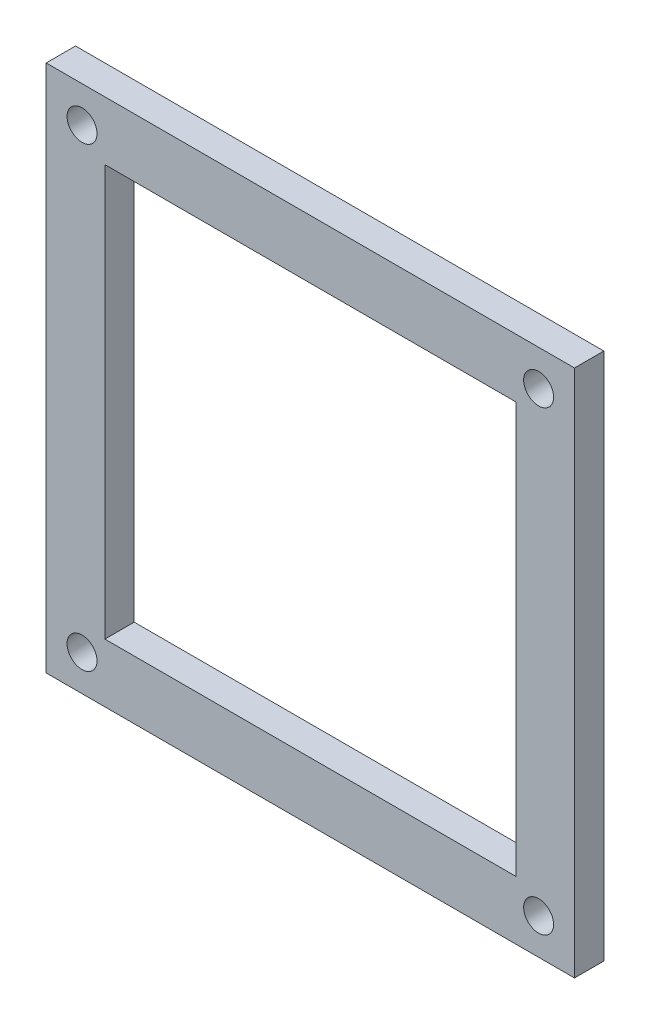
ISO-10303-21;
HEADER;
FILE_DESCRIPTION(('STEP AP214'),'2;1');
FILE_NAME('part.step','',(''),(''),'','','');
FILE_SCHEMA(('AUTOMOTIVE_DESIGN { 1 0 10303 214 1 1 1 1 }'));
ENDSEC;
DATA;
#1=APPLICATION_CONTEXT('core data for automotive mechanical design processes');
#2=APPLICATION_PROTOCOL_DEFINITION('international standard','automotive_design',2000,#1);
#3=PRODUCT_CONTEXT('',#1,'mechanical');
#4=PRODUCT('Part','Part','',(#3));
#5=PRODUCT_RELATED_PRODUCT_CATEGORY('part','',(#4));
#6=PRODUCT_DEFINITION_FORMATION('','',#4);
#7=PRODUCT_DEFINITION_CONTEXT('part definition',#1,'design');
#8=PRODUCT_DEFINITION('design','',#6,#7);
#9=PRODUCT_DEFINITION_SHAPE('','',#8);
#10=(LENGTH_UNIT() NAMED_UNIT(*) SI_UNIT(.MILLI.,.METRE.));
#11=(NAMED_UNIT(*) PLANE_ANGLE_UNIT() SI_UNIT($,.RADIAN.));
#12=(NAMED_UNIT(*) SI_UNIT($,.STERADIAN.) SOLID_ANGLE_UNIT());
#13=UNCERTAINTY_MEASURE_WITH_UNIT(LENGTH_MEASURE(1.E-05),#10,'distance_accuracy_value','');
#14=(GEOMETRIC_REPRESENTATION_CONTEXT(3) GLOBAL_UNCERTAINTY_ASSIGNED_CONTEXT((#13)) GLOBAL_UNIT_ASSIGNED_CONTEXT((#10,
#11,#12)) REPRESENTATION_CONTEXT('',''));
#15=CARTESIAN_POINT('',(0.,0.,0.));
#16=DIRECTION('',(0.,0.,1.));
#17=DIRECTION('',(1.,0.,0.));
#18=AXIS2_PLACEMENT_3D('',#15,#16,#17);
#19=CARTESIAN_POINT('',(0.,0.,5.));
#20=DIRECTION('',(0.,0.,1.));
#21=DIRECTION('',(1.,0.,0.));
#22=AXIS2_PLACEMENT_3D('',#19,#20,#21);
#23=PLANE('',#22);
#24=CARTESIAN_POINT('',(38.8908729652601,-38.8908729652601,5.));
#25=DIRECTION('',(0.,0.,1.));
#26=DIRECTION('',(1.,0.,0.));
#27=AXIS2_PLACEMENT_3D('',#24,#25,#26);
#28=CIRCLE('',#27,2.55);
#29=CARTESIAN_POINT('',(41.4408729652601,-38.8908729652601,5.));
#30=VERTEX_POINT('',#29);
#31=EDGE_CURVE('E245',#30,#30,#28,.T.);
#32=ORIENTED_EDGE('',*,*,#31,.F.);
#33=EDGE_LOOP('',(#32));
#34=FACE_BOUND('',#33,.T.);
#35=CARTESIAN_POINT('',(-38.8908729652601,38.8908729652601,5.));
#36=DIRECTION('',(0.,0.,1.));
#37=DIRECTION('',(1.,0.,0.));
#38=AXIS2_PLACEMENT_3D('',#35,#36,#37);
#39=CIRCLE('',#38,2.55);
#40=CARTESIAN_POINT('',(-36.3408729652601,38.8908729652601,5.));
#41=VERTEX_POINT('',#40);
#42=EDGE_CURVE('E127',#41,#41,#39,.T.);
#43=ORIENTED_EDGE('',*,*,#42,.F.);
#44=EDGE_LOOP('',(#43));
#45=FACE_BOUND('',#44,.T.);
#46=DIRECTION('',(0.,-1.,0.));
#47=VECTOR('',#46,1.);
#48=CARTESIAN_POINT('',(-45.,-45.,5.));
#49=LINE('',#48,#47);
#50=CARTESIAN_POINT('',(-45.,45.,5.));
#51=VERTEX_POINT('',#50);
#52=CARTESIAN_POINT('',(-45.,-45.,5.));
#53=VERTEX_POINT('',#52);
#54=EDGE_CURVE('E137',#51,#53,#49,.T.);
#55=ORIENTED_EDGE('',*,*,#54,.T.);
#56=DIRECTION('',(1.,0.,0.));
#57=VECTOR('',#56,1.);
#58=CARTESIAN_POINT('',(45.,-45.,5.));
#59=LINE('',#58,#57);
#60=CARTESIAN_POINT('',(45.,-45.,5.));
#61=VERTEX_POINT('',#60);
#62=EDGE_CURVE('E140',#53,#61,#59,.T.);
#63=ORIENTED_EDGE('',*,*,#62,.T.);
#64=DIRECTION('',(0.,1.,0.));
#65=VECTOR('',#64,1.);
#66=CARTESIAN_POINT('',(45.,-45.,5.));
#67=LINE('',#66,#65);
#68=CARTESIAN_POINT('',(45.,45.,5.));
#69=VERTEX_POINT('',#68);
#70=EDGE_CURVE('E143',#61,#69,#67,.T.);
#71=ORIENTED_EDGE('',*,*,#70,.T.);
#72=DIRECTION('',(-1.,0.,0.));
#73=VECTOR('',#72,1.);
#74=CARTESIAN_POINT('',(45.,45.,5.));
#75=LINE('',#74,#73);
#76=EDGE_CURVE('E145',#69,#51,#75,.T.);
#77=ORIENTED_EDGE('',*,*,#76,.T.);
#78=EDGE_LOOP('',(#55,#63,#71,#77));
#79=FACE_BOUND('',#78,.T.);
#80=DIRECTION('',(1.,0.,0.));
#81=VECTOR('',#80,1.);
#82=CARTESIAN_POINT('',(35.,-35.,5.));
#83=LINE('',#82,#81);
#84=CARTESIAN_POINT('',(-35.,-35.,5.));
#85=VERTEX_POINT('',#84);
#86=CARTESIAN_POINT('',(35.,-35.,5.));
#87=VERTEX_POINT('',#86);
#88=EDGE_CURVE('E106',#85,#87,#83,.T.);
#89=ORIENTED_EDGE('',*,*,#88,.F.);
#90=DIRECTION('',(0.,-1.,0.));
#91=VECTOR('',#90,1.);
#92=CARTESIAN_POINT('',(-35.,-35.,5.));
#93=LINE('',#92,#91);
#94=CARTESIAN_POINT('',(-35.,35.,5.));
#95=VERTEX_POINT('',#94);
#96=EDGE_CURVE('E98',#95,#85,#93,.T.);
#97=ORIENTED_EDGE('',*,*,#96,.F.);
#98=DIRECTION('',(-1.,0.,0.));
#99=VECTOR('',#98,1.);
#100=CARTESIAN_POINT('',(35.,35.,5.));
#101=LINE('',#100,#99);
#102=CARTESIAN_POINT('',(35.,35.,5.));
#103=VERTEX_POINT('',#102);
#104=EDGE_CURVE('E121',#103,#95,#101,.T.);
#105=ORIENTED_EDGE('',*,*,#104,.F.);
#106=DIRECTION('',(0.,1.,0.));
#107=VECTOR('',#106,1.);
#108=CARTESIAN_POINT('',(35.,-35.,5.));
#109=LINE('',#108,#107);
#110=EDGE_CURVE('E119',#87,#103,#109,.T.);
#111=ORIENTED_EDGE('',*,*,#110,.F.);
#112=EDGE_LOOP('',(#89,#97,#105,#111));
#113=FACE_BOUND('',#112,.T.);
#114=CARTESIAN_POINT('',(38.8908729652601,38.8908729652601,5.));
#115=DIRECTION('',(0.,0.,1.));
#116=DIRECTION('',(-1.,0.,0.));
#117=AXIS2_PLACEMENT_3D('',#114,#115,#116);
#118=CIRCLE('',#117,2.55);
#119=CARTESIAN_POINT('',(36.3408729652601,38.8908729652601,5.));
#120=VERTEX_POINT('',#119);
#121=EDGE_CURVE('E251',#120,#120,#118,.T.);
#122=ORIENTED_EDGE('',*,*,#121,.F.);
#123=EDGE_LOOP('',(#122));
#124=FACE_BOUND('',#123,.T.);
#125=CARTESIAN_POINT('',(-38.8908729652601,-38.8908729652601,5.));
#126=DIRECTION('',(0.,0.,1.));
#127=DIRECTION('',(-1.,0.,0.));
#128=AXIS2_PLACEMENT_3D('',#125,#126,#127);
#129=CIRCLE('',#128,2.55);
#130=CARTESIAN_POINT('',(-41.4408729652601,-38.8908729652601,5.));
#131=VERTEX_POINT('',#130);
#132=EDGE_CURVE('E236',#131,#131,#129,.T.);
#133=ORIENTED_EDGE('',*,*,#132,.F.);
#134=EDGE_LOOP('',(#133));
#135=FACE_BOUND('',#134,.T.);
#136=ADVANCED_FACE('F33',(#34,#45,#79,#113,#124,#135),#23,.T.);
#137=CARTESIAN_POINT('',(0.,0.,0.));
#138=DIRECTION('',(0.,0.,1.));
#139=DIRECTION('',(1.,0.,0.));
#140=AXIS2_PLACEMENT_3D('',#137,#138,#139);
#141=PLANE('',#140);
#142=DIRECTION('',(0.,-1.,0.));
#143=VECTOR('',#142,1.);
#144=CARTESIAN_POINT('',(-45.,-45.,0.));
#145=LINE('',#144,#143);
#146=CARTESIAN_POINT('',(-45.,45.,0.));
#147=VERTEX_POINT('',#146);
#148=CARTESIAN_POINT('',(-45.,-45.,0.));
#149=VERTEX_POINT('',#148);
#150=EDGE_CURVE('E114',#147,#149,#145,.T.);
#151=ORIENTED_EDGE('',*,*,#150,.F.);
#152=DIRECTION('',(-1.,0.,0.));
#153=VECTOR('',#152,1.);
#154=CARTESIAN_POINT('',(45.,45.,0.));
#155=LINE('',#154,#153);
#156=CARTESIAN_POINT('',(45.,45.,0.));
#157=VERTEX_POINT('',#156);
#158=EDGE_CURVE('E141',#157,#147,#155,.T.);
#159=ORIENTED_EDGE('',*,*,#158,.F.);
#160=DIRECTION('',(0.,1.,0.));
#161=VECTOR('',#160,1.);
#162=CARTESIAN_POINT('',(45.,-45.,0.));
#163=LINE('',#162,#161);
#164=CARTESIAN_POINT('',(45.,-45.,0.));
#165=VERTEX_POINT('',#164);
#166=EDGE_CURVE('E152',#165,#157,#163,.T.);
#167=ORIENTED_EDGE('',*,*,#166,.F.);
#168=DIRECTION('',(1.,0.,0.));
#169=VECTOR('',#168,1.);
#170=CARTESIAN_POINT('',(45.,-45.,0.));
#171=LINE('',#170,#169);
#172=EDGE_CURVE('E150',#149,#165,#171,.T.);
#173=ORIENTED_EDGE('',*,*,#172,.F.);
#174=EDGE_LOOP('',(#151,#159,#167,#173));
#175=FACE_BOUND('',#174,.T.);
#176=DIRECTION('',(0.,-1.,0.));
#177=VECTOR('',#176,1.);
#178=CARTESIAN_POINT('',(-35.,-35.,0.));
#179=LINE('',#178,#177);
#180=CARTESIAN_POINT('',(-35.,35.,0.));
#181=VERTEX_POINT('',#180);
#182=CARTESIAN_POINT('',(-35.,-35.,0.));
#183=VERTEX_POINT('',#182);
#184=EDGE_CURVE('E56',#181,#183,#179,.T.);
#185=ORIENTED_EDGE('',*,*,#184,.T.);
#186=DIRECTION('',(1.,0.,0.));
#187=VECTOR('',#186,1.);
#188=CARTESIAN_POINT('',(35.,-35.,0.));
#189=LINE('',#188,#187);
#190=CARTESIAN_POINT('',(35.,-35.,0.));
#191=VERTEX_POINT('',#190);
#192=EDGE_CURVE('E113',#183,#191,#189,.T.);
#193=ORIENTED_EDGE('',*,*,#192,.T.);
#194=DIRECTION('',(0.,1.,0.));
#195=VECTOR('',#194,1.);
#196=CARTESIAN_POINT('',(35.,-35.,0.));
#197=LINE('',#196,#195);
#198=CARTESIAN_POINT('',(35.,35.,0.));
#199=VERTEX_POINT('',#198);
#200=EDGE_CURVE('E129',#191,#199,#197,.T.);
#201=ORIENTED_EDGE('',*,*,#200,.T.);
#202=DIRECTION('',(-1.,0.,0.));
#203=VECTOR('',#202,1.);
#204=CARTESIAN_POINT('',(35.,35.,0.));
#205=LINE('',#204,#203);
#206=EDGE_CURVE('E107',#199,#181,#205,.T.);
#207=ORIENTED_EDGE('',*,*,#206,.T.);
#208=EDGE_LOOP('',(#185,#193,#201,#207));
#209=FACE_BOUND('',#208,.T.);
#210=CARTESIAN_POINT('',(-38.8908729652601,38.8908729652601,0.));
#211=DIRECTION('',(0.,0.,1.));
#212=DIRECTION('',(1.,0.,0.));
#213=AXIS2_PLACEMENT_3D('',#210,#211,#212);
#214=CIRCLE('',#213,2.55);
#215=CARTESIAN_POINT('',(-36.3408729652601,38.8908729652601,0.));
#216=VERTEX_POINT('',#215);
#217=EDGE_CURVE('E254',#216,#216,#214,.T.);
#218=ORIENTED_EDGE('',*,*,#217,.T.);
#219=EDGE_LOOP('',(#218));
#220=FACE_BOUND('',#219,.T.);
#221=CARTESIAN_POINT('',(38.8908729652601,38.8908729652601,0.));
#222=DIRECTION('',(0.,0.,1.));
#223=DIRECTION('',(-1.,0.,0.));
#224=AXIS2_PLACEMENT_3D('',#221,#222,#223);
#225=CIRCLE('',#224,2.55);
#226=CARTESIAN_POINT('',(36.3408729652601,38.8908729652601,0.));
#227=VERTEX_POINT('',#226);
#228=EDGE_CURVE('E248',#227,#227,#225,.T.);
#229=ORIENTED_EDGE('',*,*,#228,.T.);
#230=EDGE_LOOP('',(#229));
#231=FACE_BOUND('',#230,.T.);
#232=CARTESIAN_POINT('',(38.8908729652601,-38.8908729652601,0.));
#233=DIRECTION('',(0.,0.,1.));
#234=DIRECTION('',(1.,0.,0.));
#235=AXIS2_PLACEMENT_3D('',#232,#233,#234);
#236=CIRCLE('',#235,2.55);
#237=CARTESIAN_POINT('',(41.4408729652601,-38.8908729652601,0.));
#238=VERTEX_POINT('',#237);
#239=EDGE_CURVE('E242',#238,#238,#236,.T.);
#240=ORIENTED_EDGE('',*,*,#239,.T.);
#241=EDGE_LOOP('',(#240));
#242=FACE_BOUND('',#241,.T.);
#243=CARTESIAN_POINT('',(-38.8908729652601,-38.8908729652601,0.));
#244=DIRECTION('',(0.,0.,1.));
#245=DIRECTION('',(-1.,0.,0.));
#246=AXIS2_PLACEMENT_3D('',#243,#244,#245);
#247=CIRCLE('',#246,2.55);
#248=CARTESIAN_POINT('',(-41.4408729652601,-38.8908729652601,0.));
#249=VERTEX_POINT('',#248);
#250=EDGE_CURVE('E239',#249,#249,#247,.T.);
#251=ORIENTED_EDGE('',*,*,#250,.T.);
#252=EDGE_LOOP('',(#251));
#253=FACE_BOUND('',#252,.T.);
#254=ADVANCED_FACE('F170',(#175,#209,#220,#231,#242,#253),#141,.F.);
#255=CARTESIAN_POINT('',(-45.,-45.,5.));
#256=DIRECTION('',(1.,0.,0.));
#257=DIRECTION('',(0.,0.,-1.));
#258=AXIS2_PLACEMENT_3D('',#255,#256,#257);
#259=PLANE('',#258);
#260=ORIENTED_EDGE('',*,*,#150,.T.);
#261=DIRECTION('',(0.,0.,-1.));
#262=VECTOR('',#261,1.);
#263=CARTESIAN_POINT('',(-45.,-45.,5.));
#264=LINE('',#263,#262);
#265=EDGE_CURVE('E11',#53,#149,#264,.T.);
#266=ORIENTED_EDGE('',*,*,#265,.F.);
#267=ORIENTED_EDGE('',*,*,#54,.F.);
#268=DIRECTION('',(0.,0.,-1.));
#269=VECTOR('',#268,1.);
#270=CARTESIAN_POINT('',(-45.,45.,5.));
#271=LINE('',#270,#269);
#272=EDGE_CURVE('E147',#51,#147,#271,.T.);
#273=ORIENTED_EDGE('',*,*,#272,.T.);
#274=EDGE_LOOP('',(#260,#266,#267,#273));
#275=FACE_BOUND('',#274,.T.);
#276=ADVANCED_FACE('F35',(#275),#259,.F.);
#277=CARTESIAN_POINT('',(45.,-45.,5.));
#278=DIRECTION('',(0.,1.,0.));
#279=DIRECTION('',(-1.,0.,0.));
#280=AXIS2_PLACEMENT_3D('',#277,#278,#279);
#281=PLANE('',#280);
#282=ORIENTED_EDGE('',*,*,#172,.T.);
#283=DIRECTION('',(0.,0.,-1.));
#284=VECTOR('',#283,1.);
#285=CARTESIAN_POINT('',(45.,-45.,5.));
#286=LINE('',#285,#284);
#287=EDGE_CURVE('E41',#61,#165,#286,.T.);
#288=ORIENTED_EDGE('',*,*,#287,.F.);
#289=ORIENTED_EDGE('',*,*,#62,.F.);
#290=ORIENTED_EDGE('',*,*,#265,.T.);
#291=EDGE_LOOP('',(#282,#288,#289,#290));
#292=FACE_BOUND('',#291,.T.);
#293=ADVANCED_FACE('F180',(#292),#281,.F.);
#294=CARTESIAN_POINT('',(45.,-45.,5.));
#295=DIRECTION('',(-1.,0.,0.));
#296=DIRECTION('',(0.,0.,1.));
#297=AXIS2_PLACEMENT_3D('',#294,#295,#296);
#298=PLANE('',#297);
#299=ORIENTED_EDGE('',*,*,#166,.T.);
#300=DIRECTION('',(0.,0.,-1.));
#301=VECTOR('',#300,1.);
#302=CARTESIAN_POINT('',(45.,45.,5.));
#303=LINE('',#302,#301);
#304=EDGE_CURVE('E157',#69,#157,#303,.T.);
#305=ORIENTED_EDGE('',*,*,#304,.F.);
#306=ORIENTED_EDGE('',*,*,#70,.F.);
#307=ORIENTED_EDGE('',*,*,#287,.T.);
#308=EDGE_LOOP('',(#299,#305,#306,#307));
#309=FACE_BOUND('',#308,.T.);
#310=ADVANCED_FACE('F164',(#309),#298,.F.);
#311=CARTESIAN_POINT('',(45.,45.,5.));
#312=DIRECTION('',(0.,-1.,0.));
#313=DIRECTION('',(1.,0.,0.));
#314=AXIS2_PLACEMENT_3D('',#311,#312,#313);
#315=PLANE('',#314);
#316=ORIENTED_EDGE('',*,*,#158,.T.);
#317=ORIENTED_EDGE('',*,*,#272,.F.);
#318=ORIENTED_EDGE('',*,*,#76,.F.);
#319=ORIENTED_EDGE('',*,*,#304,.T.);
#320=EDGE_LOOP('',(#316,#317,#318,#319));
#321=FACE_BOUND('',#320,.T.);
#322=ADVANCED_FACE('F174',(#321),#315,.F.);
#323=CARTESIAN_POINT('',(-35.,-35.,5.));
#324=DIRECTION('',(1.,0.,0.));
#325=DIRECTION('',(0.,0.,-1.));
#326=AXIS2_PLACEMENT_3D('',#323,#324,#325);
#327=PLANE('',#326);
#328=ORIENTED_EDGE('',*,*,#184,.F.);
#329=DIRECTION('',(0.,0.,-1.));
#330=VECTOR('',#329,1.);
#331=CARTESIAN_POINT('',(-35.,35.,5.));
#332=LINE('',#331,#330);
#333=EDGE_CURVE('E102',#95,#181,#332,.T.);
#334=ORIENTED_EDGE('',*,*,#333,.F.);
#335=ORIENTED_EDGE('',*,*,#96,.T.);
#336=DIRECTION('',(0.,0.,-1.));
#337=VECTOR('',#336,1.);
#338=CARTESIAN_POINT('',(-35.,-35.,5.));
#339=LINE('',#338,#337);
#340=EDGE_CURVE('E101',#85,#183,#339,.T.);
#341=ORIENTED_EDGE('',*,*,#340,.T.);
#342=EDGE_LOOP('',(#328,#334,#335,#341));
#343=FACE_BOUND('',#342,.T.);
#344=ADVANCED_FACE('F100',(#343),#327,.T.);
#345=CARTESIAN_POINT('',(35.,-35.,5.));
#346=DIRECTION('',(0.,1.,0.));
#347=DIRECTION('',(0.,0.,1.));
#348=AXIS2_PLACEMENT_3D('',#345,#346,#347);
#349=PLANE('',#348);
#350=ORIENTED_EDGE('',*,*,#192,.F.);
#351=ORIENTED_EDGE('',*,*,#340,.F.);
#352=ORIENTED_EDGE('',*,*,#88,.T.);
#353=DIRECTION('',(0.,0.,-1.));
#354=VECTOR('',#353,1.);
#355=CARTESIAN_POINT('',(35.,-35.,5.));
#356=LINE('',#355,#354);
#357=EDGE_CURVE('E115',#87,#191,#356,.T.);
#358=ORIENTED_EDGE('',*,*,#357,.T.);
#359=EDGE_LOOP('',(#350,#351,#352,#358));
#360=FACE_BOUND('',#359,.T.);
#361=ADVANCED_FACE('F110',(#360),#349,.T.);
#362=CARTESIAN_POINT('',(35.,-35.,5.));
#363=DIRECTION('',(-1.,0.,0.));
#364=DIRECTION('',(0.,0.,1.));
#365=AXIS2_PLACEMENT_3D('',#362,#363,#364);
#366=PLANE('',#365);
#367=ORIENTED_EDGE('',*,*,#200,.F.);
#368=ORIENTED_EDGE('',*,*,#357,.F.);
#369=ORIENTED_EDGE('',*,*,#110,.T.);
#370=DIRECTION('',(0.,0.,-1.));
#371=VECTOR('',#370,1.);
#372=CARTESIAN_POINT('',(35.,35.,5.));
#373=LINE('',#372,#371);
#374=EDGE_CURVE('E48',#103,#199,#373,.T.);
#375=ORIENTED_EDGE('',*,*,#374,.T.);
#376=EDGE_LOOP('',(#367,#368,#369,#375));
#377=FACE_BOUND('',#376,.T.);
#378=ADVANCED_FACE('F206',(#377),#366,.T.);
#379=CARTESIAN_POINT('',(35.,35.,5.));
#380=DIRECTION('',(0.,-1.,0.));
#381=DIRECTION('',(0.,0.,-1.));
#382=AXIS2_PLACEMENT_3D('',#379,#380,#381);
#383=PLANE('',#382);
#384=ORIENTED_EDGE('',*,*,#206,.F.);
#385=ORIENTED_EDGE('',*,*,#374,.F.);
#386=ORIENTED_EDGE('',*,*,#104,.T.);
#387=ORIENTED_EDGE('',*,*,#333,.T.);
#388=EDGE_LOOP('',(#384,#385,#386,#387));
#389=FACE_BOUND('',#388,.T.);
#390=ADVANCED_FACE('F210',(#389),#383,.T.);
#391=CARTESIAN_POINT('',(-38.8908729652601,38.8908729652601,5.));
#392=DIRECTION('',(0.,0.,-1.));
#393=DIRECTION('',(-1.,0.,0.));
#394=AXIS2_PLACEMENT_3D('',#391,#392,#393);
#395=CYLINDRICAL_SURFACE('',#394,2.55);
#396=ORIENTED_EDGE('',*,*,#42,.T.);
#397=EDGE_LOOP('',(#396));
#398=FACE_BOUND('',#397,.T.);
#399=ORIENTED_EDGE('',*,*,#217,.F.);
#400=EDGE_LOOP('',(#399));
#401=FACE_BOUND('',#400,.T.);
#402=ADVANCED_FACE('F216',(#398,#401),#395,.F.);
#403=CARTESIAN_POINT('',(38.8908729652601,38.8908729652601,5.));
#404=DIRECTION('',(0.,0.,-1.));
#405=DIRECTION('',(-1.,0.,0.));
#406=AXIS2_PLACEMENT_3D('',#403,#404,#405);
#407=CYLINDRICAL_SURFACE('',#406,2.55);
#408=ORIENTED_EDGE('',*,*,#121,.T.);
#409=EDGE_LOOP('',(#408));
#410=FACE_BOUND('',#409,.T.);
#411=ORIENTED_EDGE('',*,*,#228,.F.);
#412=EDGE_LOOP('',(#411));
#413=FACE_BOUND('',#412,.T.);
#414=ADVANCED_FACE('F219',(#410,#413),#407,.F.);
#415=CARTESIAN_POINT('',(38.8908729652601,-38.8908729652601,5.));
#416=DIRECTION('',(0.,0.,-1.));
#417=DIRECTION('',(-1.,0.,0.));
#418=AXIS2_PLACEMENT_3D('',#415,#416,#417);
#419=CYLINDRICAL_SURFACE('',#418,2.55);
#420=ORIENTED_EDGE('',*,*,#31,.T.);
#421=EDGE_LOOP('',(#420));
#422=FACE_BOUND('',#421,.T.);
#423=ORIENTED_EDGE('',*,*,#239,.F.);
#424=EDGE_LOOP('',(#423));
#425=FACE_BOUND('',#424,.T.);
#426=ADVANCED_FACE('F223',(#422,#425),#419,.F.);
#427=CARTESIAN_POINT('',(-38.8908729652601,-38.8908729652601,5.));
#428=DIRECTION('',(0.,0.,-1.));
#429=DIRECTION('',(-1.,0.,0.));
#430=AXIS2_PLACEMENT_3D('',#427,#428,#429);
#431=CYLINDRICAL_SURFACE('',#430,2.55);
#432=ORIENTED_EDGE('',*,*,#132,.T.);
#433=EDGE_LOOP('',(#432));
#434=FACE_BOUND('',#433,.T.);
#435=ORIENTED_EDGE('',*,*,#250,.F.);
#436=EDGE_LOOP('',(#435));
#437=FACE_BOUND('',#436,.T.);
#438=ADVANCED_FACE('F227',(#434,#437),#431,.F.);
#439=CLOSED_SHELL('',(#136,#254,#276,#293,#310,#322,#344,#361,#378,#390,#402,#414,#426,#438));
#440=MANIFOLD_SOLID_BREP('B2',#439);
#441=ADVANCED_BREP_SHAPE_REPRESENTATION('',(#18,#440),#14);
#442=SHAPE_DEFINITION_REPRESENTATION(#9,#441);
ENDSEC;
END-ISO-10303-21;
